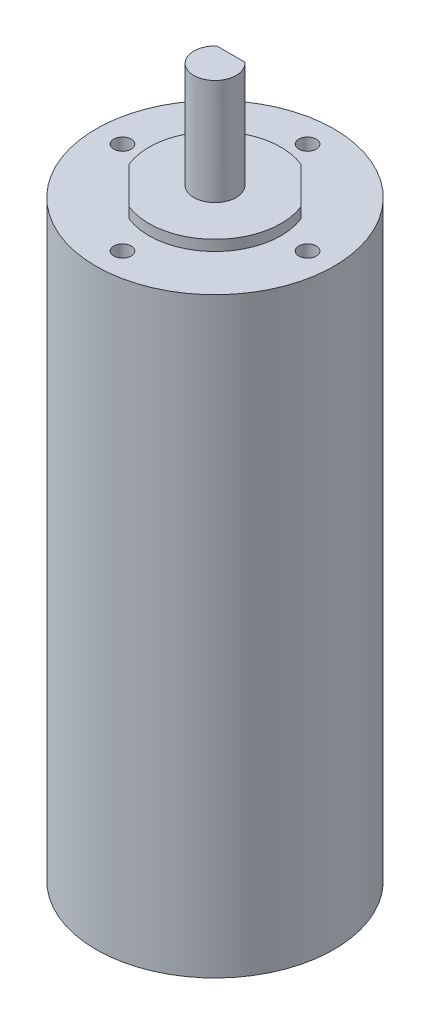
ISO-10303-21;
HEADER;
FILE_DESCRIPTION(('STEP AP214'),'2;1');
FILE_NAME('part.step','',(''),(''),'','','');
FILE_SCHEMA(('AUTOMOTIVE_DESIGN { 1 0 10303 214 1 1 1 1 }'));
ENDSEC;
DATA;
#1=APPLICATION_CONTEXT('core data for automotive mechanical design processes');
#2=APPLICATION_PROTOCOL_DEFINITION('international standard','automotive_design',2000,#1);
#3=PRODUCT_CONTEXT('',#1,'mechanical');
#4=PRODUCT('Part','Part','',(#3));
#5=PRODUCT_RELATED_PRODUCT_CATEGORY('part','',(#4));
#6=PRODUCT_DEFINITION_FORMATION('','',#4);
#7=PRODUCT_DEFINITION_CONTEXT('part definition',#1,'design');
#8=PRODUCT_DEFINITION('design','',#6,#7);
#9=PRODUCT_DEFINITION_SHAPE('','',#8);
#10=(LENGTH_UNIT() NAMED_UNIT(*) SI_UNIT(.MILLI.,.METRE.));
#11=(NAMED_UNIT(*) PLANE_ANGLE_UNIT() SI_UNIT($,.RADIAN.));
#12=(NAMED_UNIT(*) SI_UNIT($,.STERADIAN.) SOLID_ANGLE_UNIT());
#13=UNCERTAINTY_MEASURE_WITH_UNIT(LENGTH_MEASURE(1.E-05),#10,'distance_accuracy_value','');
#14=(GEOMETRIC_REPRESENTATION_CONTEXT(3) GLOBAL_UNCERTAINTY_ASSIGNED_CONTEXT((#13)) GLOBAL_UNIT_ASSIGNED_CONTEXT((#10,
#11,#12)) REPRESENTATION_CONTEXT('',''));
#15=CARTESIAN_POINT('',(0.,0.,0.));
#16=DIRECTION('',(0.,0.,1.));
#17=DIRECTION('',(1.,0.,0.));
#18=AXIS2_PLACEMENT_3D('',#15,#16,#17);
#19=CARTESIAN_POINT('',(0.,111.9,0.));
#20=DIRECTION('',(0.,-1.,0.));
#21=DIRECTION('',(0.,0.,-1.));
#22=AXIS2_PLACEMENT_3D('',#19,#20,#21);
#23=CYLINDRICAL_SURFACE('',#22,22.5);
#24=CARTESIAN_POINT('',(0.,111.9,0.));
#25=DIRECTION('',(0.,1.,0.));
#26=DIRECTION('',(0.,0.,1.));
#27=AXIS2_PLACEMENT_3D('',#24,#25,#26);
#28=CIRCLE('',#27,22.5);
#29=CARTESIAN_POINT('',(0.,111.9,-22.5));
#30=VERTEX_POINT('',#29);
#31=EDGE_CURVE('E49',#30,#30,#28,.T.);
#32=CARTESIAN_POINT('',(0.,0.,0.));
#33=DIRECTION('',(0.,1.,0.));
#34=DIRECTION('',(0.,0.,1.));
#35=AXIS2_PLACEMENT_3D('',#32,#33,#34);
#36=CIRCLE('',#35,22.5);
#37=CARTESIAN_POINT('',(0.,0.,-22.5));
#38=VERTEX_POINT('',#37);
#39=EDGE_CURVE('E44',#38,#38,#36,.T.);
#40=CARTESIAN_POINT('',(0.,111.9,-22.5));
#41=CARTESIAN_POINT('',(0.,110.734375,-22.5));
#42=CARTESIAN_POINT('',(0.,109.56875,-22.5));
#43=CARTESIAN_POINT('',(0.,107.2375,-22.5));
#44=CARTESIAN_POINT('',(0.,106.071875,-22.5));
#45=CARTESIAN_POINT('',(0.,103.740625,-22.5));
#46=CARTESIAN_POINT('',(0.,102.575,-22.5));
#47=CARTESIAN_POINT('',(0.,100.24375,-22.5));
#48=CARTESIAN_POINT('',(0.,99.078125,-22.5));
#49=CARTESIAN_POINT('',(0.,96.746875,-22.5));
#50=CARTESIAN_POINT('',(0.,95.58125,-22.5));
#51=CARTESIAN_POINT('',(0.,93.25,-22.5));
#52=CARTESIAN_POINT('',(0.,92.084375,-22.5));
#53=CARTESIAN_POINT('',(0.,89.753125,-22.5));
#54=CARTESIAN_POINT('',(0.,88.5875,-22.5));
#55=CARTESIAN_POINT('',(0.,86.25625,-22.5));
#56=CARTESIAN_POINT('',(0.,85.090625,-22.5));
#57=CARTESIAN_POINT('',(0.,82.759375,-22.5));
#58=CARTESIAN_POINT('',(0.,81.59375,-22.5));
#59=CARTESIAN_POINT('',(0.,79.2625,-22.5));
#60=CARTESIAN_POINT('',(0.,78.096875,-22.5));
#61=CARTESIAN_POINT('',(0.,75.765625,-22.5));
#62=CARTESIAN_POINT('',(0.,74.6,-22.5));
#63=CARTESIAN_POINT('',(0.,72.26875,-22.5));
#64=CARTESIAN_POINT('',(0.,71.103125,-22.5));
#65=CARTESIAN_POINT('',(0.,68.771875,-22.5));
#66=CARTESIAN_POINT('',(0.,67.60625,-22.5));
#67=CARTESIAN_POINT('',(0.,65.275,-22.5));
#68=CARTESIAN_POINT('',(0.,64.109375,-22.5));
#69=CARTESIAN_POINT('',(0.,61.778125,-22.5));
#70=CARTESIAN_POINT('',(0.,60.6125,-22.5));
#71=CARTESIAN_POINT('',(0.,58.28125,-22.5));
#72=CARTESIAN_POINT('',(0.,57.115625,-22.5));
#73=CARTESIAN_POINT('',(0.,54.784375,-22.5));
#74=CARTESIAN_POINT('',(0.,53.61875,-22.5));
#75=CARTESIAN_POINT('',(0.,51.2875,-22.5));
#76=CARTESIAN_POINT('',(0.,50.121875,-22.5));
#77=CARTESIAN_POINT('',(0.,47.790625,-22.5));
#78=CARTESIAN_POINT('',(0.,46.625,-22.5));
#79=CARTESIAN_POINT('',(0.,44.29375,-22.5));
#80=CARTESIAN_POINT('',(0.,43.128125,-22.5));
#81=CARTESIAN_POINT('',(0.,40.796875,-22.5));
#82=CARTESIAN_POINT('',(0.,39.63125,-22.5));
#83=CARTESIAN_POINT('',(0.,37.3,-22.5));
#84=CARTESIAN_POINT('',(0.,36.134375,-22.5));
#85=CARTESIAN_POINT('',(0.,33.803125,-22.5));
#86=CARTESIAN_POINT('',(0.,32.6375,-22.5));
#87=CARTESIAN_POINT('',(0.,30.30625,-22.5));
#88=CARTESIAN_POINT('',(0.,29.140625,-22.5));
#89=CARTESIAN_POINT('',(0.,26.809375,-22.5));
#90=CARTESIAN_POINT('',(0.,25.64375,-22.5));
#91=CARTESIAN_POINT('',(0.,23.3125,-22.5));
#92=CARTESIAN_POINT('',(0.,22.146875,-22.5));
#93=CARTESIAN_POINT('',(0.,19.815625,-22.5));
#94=CARTESIAN_POINT('',(0.,18.65,-22.5));
#95=CARTESIAN_POINT('',(0.,16.31875,-22.5));
#96=CARTESIAN_POINT('',(0.,15.153125,-22.5));
#97=CARTESIAN_POINT('',(0.,12.821875,-22.5));
#98=CARTESIAN_POINT('',(0.,11.65625,-22.5));
#99=CARTESIAN_POINT('',(0.,9.32499999999999,-22.5));
#100=CARTESIAN_POINT('',(0.,8.15937499999999,-22.5));
#101=CARTESIAN_POINT('',(0.,5.82812499999999,-22.5));
#102=CARTESIAN_POINT('',(0.,4.66249999999999,-22.5));
#103=CARTESIAN_POINT('',(0.,2.33124999999998,-22.5));
#104=CARTESIAN_POINT('',(0.,1.16562499999998,-22.5));
#105=CARTESIAN_POINT('',(0.,0.,-22.5));
#106=B_SPLINE_CURVE_WITH_KNOTS('',3,(#40,#41,#42,#43,#44,#45,#46,#47,#48,#49,#50,#51,#52,#53,
#54,#55,#56,#57,#58,#59,#60,#61,#62,#63,#64,#65,#66,#67,#68,#69,#70,#71,#72,#73,#74,#75,#76,#77,
#78,#79,#80,#81,#82,#83,#84,#85,#86,#87,#88,#89,#90,#91,#92,#93,#94,#95,#96,#97,#98,#99,#100,
#101,#102,#103,#104,#105),.UNSPECIFIED.,.F.,.F.,(4,2,2,2,2,2,2,2,2,2,2,2,2,2,2,2,2,2,2,2,2,2,2,
2,2,2,2,2,2,2,2,2,4),(0.,3.496875,6.99374999999999,10.490625,13.9875,17.484375,20.98125,
24.478125,27.975,31.471875,34.96875,38.465625,41.9625,45.459375,48.95625,52.453125,55.95,
59.446875,62.94375,66.440625,69.9375,73.434375,76.93125,80.428125,83.925,87.421875,90.91875,
94.415625,97.9125,101.409375,104.90625,108.403125,111.9),.UNSPECIFIED.);
#107=EDGE_CURVE('BSEAM41',#30,#38,#106,.T.);
#108=ORIENTED_EDGE('',*,*,#31,.F.);
#109=ORIENTED_EDGE('',*,*,#39,.T.);
#110=ORIENTED_EDGE('',*,*,#107,.T.);
#111=ORIENTED_EDGE('',*,*,#107,.F.);
#112=EDGE_LOOP('',(#108,#110,#109,#111));
#113=FACE_BOUND('',#112,.T.);
#114=ADVANCED_FACE('F41',(#113),#23,.T.);
#115=CARTESIAN_POINT('',(0.,111.9,0.));
#116=DIRECTION('',(0.,1.,0.));
#117=DIRECTION('',(0.,0.,1.));
#118=AXIS2_PLACEMENT_3D('',#115,#116,#117);
#119=PLANE('',#118);
#120=CARTESIAN_POINT('',(-17.5,111.9,0.));
#121=DIRECTION('',(0.,1.,0.));
#122=DIRECTION('',(0.,0.,1.));
#123=AXIS2_PLACEMENT_3D('',#120,#121,#122);
#124=CIRCLE('',#123,1.65);
#125=CARTESIAN_POINT('',(-17.5,111.9,1.65));
#126=VERTEX_POINT('',#125);
#127=EDGE_CURVE('E355',#126,#126,#124,.T.);
#128=ORIENTED_EDGE('',*,*,#127,.F.);
#129=EDGE_LOOP('',(#128));
#130=FACE_BOUND('',#129,.T.);
#131=CARTESIAN_POINT('',(0.,111.9,-17.5));
#132=DIRECTION('',(0.,1.,0.));
#133=DIRECTION('',(0.,0.,1.));
#134=AXIS2_PLACEMENT_3D('',#131,#132,#133);
#135=CIRCLE('',#134,1.65);
#136=CARTESIAN_POINT('',(0.,111.9,-15.85));
#137=VERTEX_POINT('',#136);
#138=EDGE_CURVE('E363',#137,#137,#135,.T.);
#139=ORIENTED_EDGE('',*,*,#138,.F.);
#140=EDGE_LOOP('',(#139));
#141=FACE_BOUND('',#140,.T.);
#142=CARTESIAN_POINT('',(17.5,111.9,0.));
#143=DIRECTION('',(0.,1.,0.));
#144=DIRECTION('',(0.,0.,1.));
#145=AXIS2_PLACEMENT_3D('',#142,#143,#144);
#146=CIRCLE('',#145,1.65);
#147=CARTESIAN_POINT('',(17.5,111.9,1.65));
#148=VERTEX_POINT('',#147);
#149=EDGE_CURVE('E369',#148,#148,#146,.T.);
#150=ORIENTED_EDGE('',*,*,#149,.F.);
#151=EDGE_LOOP('',(#150));
#152=FACE_BOUND('',#151,.T.);
#153=CARTESIAN_POINT('',(0.,111.9,17.5));
#154=DIRECTION('',(0.,1.,0.));
#155=DIRECTION('',(0.,0.,1.));
#156=AXIS2_PLACEMENT_3D('',#153,#154,#155);
#157=CIRCLE('',#156,1.65);
#158=CARTESIAN_POINT('',(0.,111.9,19.15));
#159=VERTEX_POINT('',#158);
#160=EDGE_CURVE('E375',#159,#159,#157,.T.);
#161=ORIENTED_EDGE('',*,*,#160,.F.);
#162=EDGE_LOOP('',(#161));
#163=FACE_BOUND('',#162,.T.);
#164=CARTESIAN_POINT('',(0.,111.9,0.));
#165=DIRECTION('',(0.,1.,0.));
#166=DIRECTION('',(0.,0.,1.));
#167=AXIS2_PLACEMENT_3D('',#164,#165,#166);
#168=CIRCLE('',#167,12.5);
#169=CARTESIAN_POINT('',(4.66762636850755,111.9,-11.595829598783));
#170=VERTEX_POINT('',#169);
#171=CARTESIAN_POINT('',(-11.5958295987831,111.9,4.66762636850752));
#172=VERTEX_POINT('',#171);
#173=EDGE_CURVE('E64',#170,#172,#168,.T.);
#174=ORIENTED_EDGE('',*,*,#173,.F.);
#175=DIRECTION('',(-0.707106781186546,0.,-0.707106781186549));
#176=VECTOR('',#175,1.);
#177=CARTESIAN_POINT('',(11.5958295987831,111.9,-4.66762636850751));
#178=LINE('',#177,#176);
#179=CARTESIAN_POINT('',(11.5958295987831,111.9,-4.66762636850751));
#180=VERTEX_POINT('',#179);
#181=EDGE_CURVE('E121',#180,#170,#178,.T.);
#182=ORIENTED_EDGE('',*,*,#181,.F.);
#183=CARTESIAN_POINT('',(0.,111.9,0.));
#184=DIRECTION('',(0.,1.,0.));
#185=DIRECTION('',(0.,0.,1.));
#186=AXIS2_PLACEMENT_3D('',#183,#184,#185);
#187=CIRCLE('',#186,12.5);
#188=CARTESIAN_POINT('',(-4.66762636850757,111.9,11.595829598783));
#189=VERTEX_POINT('',#188);
#190=EDGE_CURVE('E132',#189,#180,#187,.T.);
#191=ORIENTED_EDGE('',*,*,#190,.F.);
#192=DIRECTION('',(0.707106781186546,0.,0.707106781186549));
#193=VECTOR('',#192,1.);
#194=CARTESIAN_POINT('',(-11.5958295987831,111.9,4.66762636850752));
#195=LINE('',#194,#193);
#196=EDGE_CURVE('E129',#172,#189,#195,.T.);
#197=ORIENTED_EDGE('',*,*,#196,.F.);
#198=EDGE_LOOP('',(#174,#182,#191,#197));
#199=FACE_BOUND('',#198,.T.);
#200=ORIENTED_EDGE('',*,*,#31,.T.);
#201=EDGE_LOOP('',(#200));
#202=FACE_BOUND('',#201,.T.);
#203=ADVANCED_FACE('F156',(#130,#141,#152,#163,#199,#202),#119,.T.);
#204=CARTESIAN_POINT('',(0.,0.,0.));
#205=DIRECTION('',(0.,1.,0.));
#206=DIRECTION('',(0.,0.,1.));
#207=AXIS2_PLACEMENT_3D('',#204,#205,#206);
#208=PLANE('',#207);
#209=ORIENTED_EDGE('',*,*,#39,.F.);
#210=EDGE_LOOP('',(#209));
#211=FACE_BOUND('',#210,.T.);
#212=ADVANCED_FACE('F153',(#211),#208,.F.);
#213=CARTESIAN_POINT('',(0.,113.9,0.));
#214=DIRECTION('',(0.,-1.,0.));
#215=DIRECTION('',(0.,0.,-1.));
#216=AXIS2_PLACEMENT_3D('',#213,#214,#215);
#217=CYLINDRICAL_SURFACE('',#216,12.5);
#218=ORIENTED_EDGE('',*,*,#173,.T.);
#219=DIRECTION('',(0.,-1.,0.));
#220=VECTOR('',#219,1.);
#221=CARTESIAN_POINT('',(-11.5958295987831,113.9,4.66762636850752));
#222=LINE('',#221,#220);
#223=CARTESIAN_POINT('',(-11.5958295987831,113.9,4.66762636850752));
#224=VERTEX_POINT('',#223);
#225=EDGE_CURVE('E144',#224,#172,#222,.T.);
#226=ORIENTED_EDGE('',*,*,#225,.F.);
#227=CARTESIAN_POINT('',(0.,113.9,0.));
#228=DIRECTION('',(0.,1.,0.));
#229=DIRECTION('',(0.,0.,1.));
#230=AXIS2_PLACEMENT_3D('',#227,#228,#229);
#231=CIRCLE('',#230,12.5);
#232=CARTESIAN_POINT('',(4.66762636850755,113.9,-11.595829598783));
#233=VERTEX_POINT('',#232);
#234=EDGE_CURVE('E117',#233,#224,#231,.T.);
#235=ORIENTED_EDGE('',*,*,#234,.F.);
#236=DIRECTION('',(0.,-1.,0.));
#237=VECTOR('',#236,1.);
#238=CARTESIAN_POINT('',(4.66762636850755,113.9,-11.595829598783));
#239=LINE('',#238,#237);
#240=EDGE_CURVE('E127',#233,#170,#239,.T.);
#241=ORIENTED_EDGE('',*,*,#240,.T.);
#242=EDGE_LOOP('',(#218,#226,#235,#241));
#243=FACE_BOUND('',#242,.T.);
#244=ADVANCED_FACE('F155',(#243),#217,.T.);
#245=CARTESIAN_POINT('',(-11.5958295987831,113.9,4.66762636850752));
#246=DIRECTION('',(0.707106781186549,0.,-0.707106781186546));
#247=DIRECTION('',(-0.707106781186546,0.,-0.707106781186549));
#248=AXIS2_PLACEMENT_3D('',#245,#246,#247);
#249=PLANE('',#248);
#250=ORIENTED_EDGE('',*,*,#196,.T.);
#251=DIRECTION('',(0.,-1.,0.));
#252=VECTOR('',#251,1.);
#253=CARTESIAN_POINT('',(-4.66762636850757,113.9,11.595829598783));
#254=LINE('',#253,#252);
#255=CARTESIAN_POINT('',(-4.66762636850757,113.9,11.595829598783));
#256=VERTEX_POINT('',#255);
#257=EDGE_CURVE('E141',#256,#189,#254,.T.);
#258=ORIENTED_EDGE('',*,*,#257,.F.);
#259=DIRECTION('',(0.707106781186546,0.,0.707106781186549));
#260=VECTOR('',#259,1.);
#261=CARTESIAN_POINT('',(-11.5958295987831,113.9,4.66762636850752));
#262=LINE('',#261,#260);
#263=EDGE_CURVE('E120',#224,#256,#262,.T.);
#264=ORIENTED_EDGE('',*,*,#263,.F.);
#265=ORIENTED_EDGE('',*,*,#225,.T.);
#266=EDGE_LOOP('',(#250,#258,#264,#265));
#267=FACE_BOUND('',#266,.T.);
#268=ADVANCED_FACE('F161',(#267),#249,.F.);
#269=CARTESIAN_POINT('',(0.,113.9,0.));
#270=DIRECTION('',(0.,-1.,0.));
#271=DIRECTION('',(0.,0.,-1.));
#272=AXIS2_PLACEMENT_3D('',#269,#270,#271);
#273=CYLINDRICAL_SURFACE('',#272,12.5);
#274=ORIENTED_EDGE('',*,*,#190,.T.);
#275=DIRECTION('',(0.,-1.,0.));
#276=VECTOR('',#275,1.);
#277=CARTESIAN_POINT('',(11.5958295987831,113.9,-4.66762636850751));
#278=LINE('',#277,#276);
#279=CARTESIAN_POINT('',(11.5958295987831,113.9,-4.66762636850751));
#280=VERTEX_POINT('',#279);
#281=EDGE_CURVE('E138',#280,#180,#278,.T.);
#282=ORIENTED_EDGE('',*,*,#281,.F.);
#283=CARTESIAN_POINT('',(0.,113.9,0.));
#284=DIRECTION('',(0.,1.,0.));
#285=DIRECTION('',(0.,0.,1.));
#286=AXIS2_PLACEMENT_3D('',#283,#284,#285);
#287=CIRCLE('',#286,12.5);
#288=EDGE_CURVE('E123',#256,#280,#287,.T.);
#289=ORIENTED_EDGE('',*,*,#288,.F.);
#290=ORIENTED_EDGE('',*,*,#257,.T.);
#291=EDGE_LOOP('',(#274,#282,#289,#290));
#292=FACE_BOUND('',#291,.T.);
#293=ADVANCED_FACE('F281',(#292),#273,.T.);
#294=CARTESIAN_POINT('',(11.5958295987831,113.9,-4.66762636850751));
#295=DIRECTION('',(-0.707106781186549,0.,0.707106781186546));
#296=DIRECTION('',(0.707106781186546,0.,0.707106781186549));
#297=AXIS2_PLACEMENT_3D('',#294,#295,#296);
#298=PLANE('',#297);
#299=ORIENTED_EDGE('',*,*,#181,.T.);
#300=ORIENTED_EDGE('',*,*,#240,.F.);
#301=DIRECTION('',(-0.707106781186546,0.,-0.707106781186549));
#302=VECTOR('',#301,1.);
#303=CARTESIAN_POINT('',(11.5958295987831,113.9,-4.66762636850751));
#304=LINE('',#303,#302);
#305=EDGE_CURVE('E125',#280,#233,#304,.T.);
#306=ORIENTED_EDGE('',*,*,#305,.F.);
#307=ORIENTED_EDGE('',*,*,#281,.T.);
#308=EDGE_LOOP('',(#299,#300,#306,#307));
#309=FACE_BOUND('',#308,.T.);
#310=ADVANCED_FACE('F277',(#309),#298,.F.);
#311=CARTESIAN_POINT('',(0.,113.9,0.));
#312=DIRECTION('',(0.,1.,0.));
#313=DIRECTION('',(0.,0.,1.));
#314=AXIS2_PLACEMENT_3D('',#311,#312,#313);
#315=PLANE('',#314);
#316=CARTESIAN_POINT('',(0.,113.9,0.));
#317=DIRECTION('',(0.,1.,0.));
#318=DIRECTION('',(0.,0.,1.));
#319=AXIS2_PLACEMENT_3D('',#316,#317,#318);
#320=CIRCLE('',#319,4.);
#321=CARTESIAN_POINT('',(0.,113.9,4.));
#322=VERTEX_POINT('',#321);
#323=EDGE_CURVE('E11',#322,#322,#320,.T.);
#324=ORIENTED_EDGE('',*,*,#323,.F.);
#325=EDGE_LOOP('',(#324));
#326=FACE_BOUND('',#325,.T.);
#327=ORIENTED_EDGE('',*,*,#234,.T.);
#328=ORIENTED_EDGE('',*,*,#263,.T.);
#329=ORIENTED_EDGE('',*,*,#288,.T.);
#330=ORIENTED_EDGE('',*,*,#305,.T.);
#331=EDGE_LOOP('',(#327,#328,#329,#330));
#332=FACE_BOUND('',#331,.T.);
#333=ADVANCED_FACE('F274',(#326,#332),#315,.T.);
#334=CARTESIAN_POINT('',(0.,121.9,0.));
#335=DIRECTION('',(0.,-1.,0.));
#336=DIRECTION('',(0.,0.,-1.));
#337=AXIS2_PLACEMENT_3D('',#334,#335,#336);
#338=CYLINDRICAL_SURFACE('',#337,4.);
#339=CARTESIAN_POINT('',(0.,121.9,0.));
#340=DIRECTION('',(0.,1.,0.));
#341=DIRECTION('',(0.,0.,1.));
#342=AXIS2_PLACEMENT_3D('',#339,#340,#341);
#343=CIRCLE('',#342,4.);
#344=CARTESIAN_POINT('',(2.64575131106459,121.9,-3.));
#345=VERTEX_POINT('',#344);
#346=CARTESIAN_POINT('',(-2.64575131106459,121.9,-3.));
#347=VERTEX_POINT('',#346);
#348=EDGE_CURVE('E111',#345,#347,#343,.T.);
#349=ORIENTED_EDGE('',*,*,#348,.F.);
#350=DIRECTION('',(0.,-1.,0.));
#351=VECTOR('',#350,1.);
#352=CARTESIAN_POINT('',(2.64575131106459,133.9,-3.));
#353=LINE('',#352,#351);
#354=CARTESIAN_POINT('',(2.64575131106459,133.9,-3.));
#355=VERTEX_POINT('',#354);
#356=EDGE_CURVE('E99',#355,#345,#353,.T.);
#357=ORIENTED_EDGE('',*,*,#356,.F.);
#358=CARTESIAN_POINT('',(0.,133.9,0.));
#359=DIRECTION('',(0.,1.,0.));
#360=DIRECTION('',(0.,0.,1.));
#361=AXIS2_PLACEMENT_3D('',#358,#359,#360);
#362=CIRCLE('',#361,4.);
#363=CARTESIAN_POINT('',(-2.64575131106459,133.9,-3.));
#364=VERTEX_POINT('',#363);
#365=EDGE_CURVE('E104',#364,#355,#362,.T.);
#366=ORIENTED_EDGE('',*,*,#365,.F.);
#367=DIRECTION('',(0.,-1.,0.));
#368=VECTOR('',#367,1.);
#369=CARTESIAN_POINT('',(-2.64575131106459,133.9,-3.));
#370=LINE('',#369,#368);
#371=EDGE_CURVE('E101',#364,#347,#370,.T.);
#372=ORIENTED_EDGE('',*,*,#371,.T.);
#373=EDGE_LOOP('',(#349,#357,#366,#372));
#374=FACE_BOUND('',#373,.T.);
#375=ORIENTED_EDGE('',*,*,#323,.T.);
#376=EDGE_LOOP('',(#375));
#377=FACE_BOUND('',#376,.T.);
#378=ADVANCED_FACE('F109',(#374,#377),#338,.T.);
#379=CARTESIAN_POINT('',(0.,121.9,0.));
#380=DIRECTION('',(0.,1.,0.));
#381=DIRECTION('',(0.,0.,1.));
#382=AXIS2_PLACEMENT_3D('',#379,#380,#381);
#383=PLANE('',#382);
#384=DIRECTION('',(-1.,0.,0.));
#385=VECTOR('',#384,1.);
#386=CARTESIAN_POINT('',(-2.64575131106459,121.9,-3.));
#387=LINE('',#386,#385);
#388=EDGE_CURVE('E56',#345,#347,#387,.T.);
#389=ORIENTED_EDGE('',*,*,#388,.F.);
#390=ORIENTED_EDGE('',*,*,#348,.T.);
#391=EDGE_LOOP('',(#389,#390));
#392=FACE_BOUND('',#391,.T.);
#393=ADVANCED_FACE('F269',(#392),#383,.T.);
#394=CARTESIAN_POINT('',(-2.64575131106459,133.9,-3.));
#395=DIRECTION('',(0.,0.,1.));
#396=DIRECTION('',(1.,0.,0.));
#397=AXIS2_PLACEMENT_3D('',#394,#395,#396);
#398=PLANE('',#397);
#399=ORIENTED_EDGE('',*,*,#388,.T.);
#400=ORIENTED_EDGE('',*,*,#371,.F.);
#401=DIRECTION('',(-1.,0.,0.));
#402=VECTOR('',#401,1.);
#403=CARTESIAN_POINT('',(-2.64575131106459,133.9,-3.));
#404=LINE('',#403,#402);
#405=EDGE_CURVE('E95',#355,#364,#404,.T.);
#406=ORIENTED_EDGE('',*,*,#405,.F.);
#407=ORIENTED_EDGE('',*,*,#356,.T.);
#408=EDGE_LOOP('',(#399,#400,#406,#407));
#409=FACE_BOUND('',#408,.T.);
#410=ADVANCED_FACE('F97',(#409),#398,.F.);
#411=CARTESIAN_POINT('',(0.,133.9,0.));
#412=DIRECTION('',(0.,1.,0.));
#413=DIRECTION('',(0.,0.,1.));
#414=AXIS2_PLACEMENT_3D('',#411,#412,#413);
#415=PLANE('',#414);
#416=ORIENTED_EDGE('',*,*,#365,.T.);
#417=ORIENTED_EDGE('',*,*,#405,.T.);
#418=EDGE_LOOP('',(#416,#417));
#419=FACE_BOUND('',#418,.T.);
#420=ADVANCED_FACE('F106',(#419),#415,.T.);
#421=CARTESIAN_POINT('',(0.,105.9,17.5));
#422=DIRECTION('',(0.,1.,0.));
#423=DIRECTION('',(0.,0.,1.));
#424=AXIS2_PLACEMENT_3D('',#421,#422,#423);
#425=CYLINDRICAL_SURFACE('',#424,1.65);
#426=CARTESIAN_POINT('',(0.,105.9,17.5));
#427=DIRECTION('',(0.,1.,0.));
#428=DIRECTION('',(0.,0.,1.));
#429=AXIS2_PLACEMENT_3D('',#426,#427,#428);
#430=CIRCLE('',#429,1.65);
#431=CARTESIAN_POINT('',(0.,105.9,19.15));
#432=VERTEX_POINT('',#431);
#433=EDGE_CURVE('E372',#432,#432,#430,.T.);
#434=ORIENTED_EDGE('',*,*,#433,.F.);
#435=EDGE_LOOP('',(#434));
#436=FACE_BOUND('',#435,.T.);
#437=ORIENTED_EDGE('',*,*,#160,.T.);
#438=EDGE_LOOP('',(#437));
#439=FACE_BOUND('',#438,.T.);
#440=ADVANCED_FACE('F185',(#436,#439),#425,.F.);
#441=CARTESIAN_POINT('',(0.,105.9,17.5));
#442=DIRECTION('',(0.,1.,0.));
#443=DIRECTION('',(0.,0.,1.));
#444=AXIS2_PLACEMENT_3D('',#441,#442,#443);
#445=PLANE('',#444);
#446=ORIENTED_EDGE('',*,*,#433,.T.);
#447=EDGE_LOOP('',(#446));
#448=FACE_BOUND('',#447,.T.);
#449=ADVANCED_FACE('F190',(#448),#445,.T.);
#450=CARTESIAN_POINT('',(17.5,105.9,0.));
#451=DIRECTION('',(0.,1.,0.));
#452=DIRECTION('',(0.,0.,1.));
#453=AXIS2_PLACEMENT_3D('',#450,#451,#452);
#454=CYLINDRICAL_SURFACE('',#453,1.65);
#455=CARTESIAN_POINT('',(17.5,105.9,0.));
#456=DIRECTION('',(0.,1.,0.));
#457=DIRECTION('',(0.,0.,1.));
#458=AXIS2_PLACEMENT_3D('',#455,#456,#457);
#459=CIRCLE('',#458,1.65);
#460=CARTESIAN_POINT('',(17.5,105.9,1.65));
#461=VERTEX_POINT('',#460);
#462=EDGE_CURVE('E366',#461,#461,#459,.T.);
#463=ORIENTED_EDGE('',*,*,#462,.F.);
#464=EDGE_LOOP('',(#463));
#465=FACE_BOUND('',#464,.T.);
#466=ORIENTED_EDGE('',*,*,#149,.T.);
#467=EDGE_LOOP('',(#466));
#468=FACE_BOUND('',#467,.T.);
#469=ADVANCED_FACE('F200',(#465,#468),#454,.F.);
#470=CARTESIAN_POINT('',(17.5,105.9,0.));
#471=DIRECTION('',(0.,1.,0.));
#472=DIRECTION('',(0.,0.,1.));
#473=AXIS2_PLACEMENT_3D('',#470,#471,#472);
#474=PLANE('',#473);
#475=ORIENTED_EDGE('',*,*,#462,.T.);
#476=EDGE_LOOP('',(#475));
#477=FACE_BOUND('',#476,.T.);
#478=ADVANCED_FACE('F210',(#477),#474,.T.);
#479=CARTESIAN_POINT('',(0.,105.9,-17.5));
#480=DIRECTION('',(0.,1.,0.));
#481=DIRECTION('',(0.,0.,1.));
#482=AXIS2_PLACEMENT_3D('',#479,#480,#481);
#483=CYLINDRICAL_SURFACE('',#482,1.65);
#484=CARTESIAN_POINT('',(0.,105.9,-17.5));
#485=DIRECTION('',(0.,1.,0.));
#486=DIRECTION('',(0.,0.,1.));
#487=AXIS2_PLACEMENT_3D('',#484,#485,#486);
#488=CIRCLE('',#487,1.65);
#489=CARTESIAN_POINT('',(0.,105.9,-15.85));
#490=VERTEX_POINT('',#489);
#491=EDGE_CURVE('E358',#490,#490,#488,.T.);
#492=ORIENTED_EDGE('',*,*,#491,.F.);
#493=EDGE_LOOP('',(#492));
#494=FACE_BOUND('',#493,.T.);
#495=ORIENTED_EDGE('',*,*,#138,.T.);
#496=EDGE_LOOP('',(#495));
#497=FACE_BOUND('',#496,.T.);
#498=ADVANCED_FACE('F220',(#494,#497),#483,.F.);
#499=CARTESIAN_POINT('',(0.,105.9,-17.5));
#500=DIRECTION('',(0.,1.,0.));
#501=DIRECTION('',(0.,0.,1.));
#502=AXIS2_PLACEMENT_3D('',#499,#500,#501);
#503=PLANE('',#502);
#504=ORIENTED_EDGE('',*,*,#491,.T.);
#505=EDGE_LOOP('',(#504));
#506=FACE_BOUND('',#505,.T.);
#507=ADVANCED_FACE('F230',(#506),#503,.T.);
#508=CARTESIAN_POINT('',(-17.5,105.9,0.));
#509=DIRECTION('',(0.,1.,0.));
#510=DIRECTION('',(0.,0.,1.));
#511=AXIS2_PLACEMENT_3D('',#508,#509,#510);
#512=CYLINDRICAL_SURFACE('',#511,1.65);
#513=CARTESIAN_POINT('',(-17.5,105.9,0.));
#514=DIRECTION('',(0.,1.,0.));
#515=DIRECTION('',(0.,0.,1.));
#516=AXIS2_PLACEMENT_3D('',#513,#514,#515);
#517=CIRCLE('',#516,1.65);
#518=CARTESIAN_POINT('',(-17.5,105.9,1.65));
#519=VERTEX_POINT('',#518);
#520=EDGE_CURVE('E354',#519,#519,#517,.T.);
#521=ORIENTED_EDGE('',*,*,#520,.F.);
#522=EDGE_LOOP('',(#521));
#523=FACE_BOUND('',#522,.T.);
#524=ORIENTED_EDGE('',*,*,#127,.T.);
#525=EDGE_LOOP('',(#524));
#526=FACE_BOUND('',#525,.T.);
#527=ADVANCED_FACE('F240',(#523,#526),#512,.F.);
#528=CARTESIAN_POINT('',(-17.5,105.9,0.));
#529=DIRECTION('',(0.,1.,0.));
#530=DIRECTION('',(0.,0.,1.));
#531=AXIS2_PLACEMENT_3D('',#528,#529,#530);
#532=PLANE('',#531);
#533=ORIENTED_EDGE('',*,*,#520,.T.);
#534=EDGE_LOOP('',(#533));
#535=FACE_BOUND('',#534,.T.);
#536=ADVANCED_FACE('F250',(#535),#532,.T.);
#537=CLOSED_SHELL('',(#114,#203,#212,#244,#268,#293,#310,#333,#378,#393,#410,#420,#440,#449,
#469,#478,#498,#507,#527,#536));
#538=MANIFOLD_SOLID_BREP('B2',#537);
#539=ADVANCED_BREP_SHAPE_REPRESENTATION('',(#18,#538),#14);
#540=SHAPE_DEFINITION_REPRESENTATION(#9,#539);
ENDSEC;
END-ISO-10303-21;
